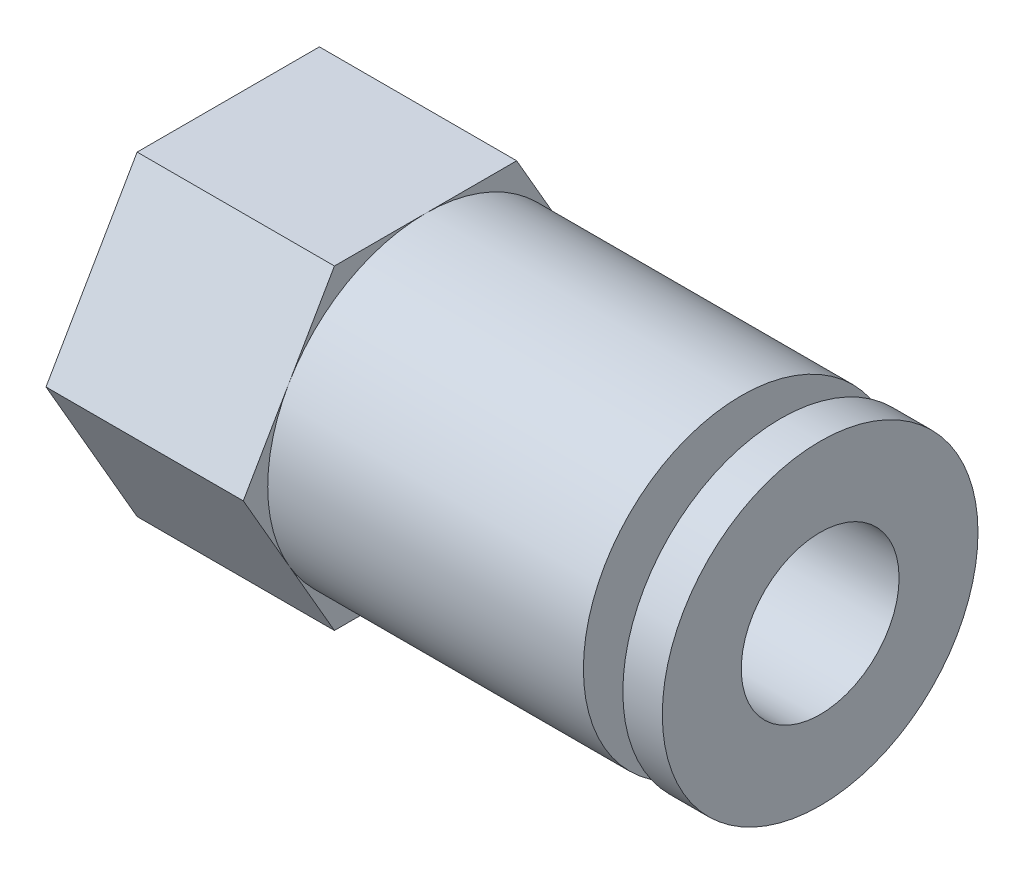
ISO-10303-21;
HEADER;
FILE_DESCRIPTION(('STEP AP214'),'2;1');
FILE_NAME('part.step','',(''),(''),'','','');
FILE_SCHEMA(('AUTOMOTIVE_DESIGN { 1 0 10303 214 1 1 1 1 }'));
ENDSEC;
DATA;
#1=APPLICATION_CONTEXT('core data for automotive mechanical design processes');
#2=APPLICATION_PROTOCOL_DEFINITION('international standard','automotive_design',2000,#1);
#3=PRODUCT_CONTEXT('',#1,'mechanical');
#4=PRODUCT('Part','Part','',(#3));
#5=PRODUCT_RELATED_PRODUCT_CATEGORY('part','',(#4));
#6=PRODUCT_DEFINITION_FORMATION('','',#4);
#7=PRODUCT_DEFINITION_CONTEXT('part definition',#1,'design');
#8=PRODUCT_DEFINITION('design','',#6,#7);
#9=PRODUCT_DEFINITION_SHAPE('','',#8);
#10=(LENGTH_UNIT() NAMED_UNIT(*) SI_UNIT(.MILLI.,.METRE.));
#11=(NAMED_UNIT(*) PLANE_ANGLE_UNIT() SI_UNIT($,.RADIAN.));
#12=(NAMED_UNIT(*) SI_UNIT($,.STERADIAN.) SOLID_ANGLE_UNIT());
#13=UNCERTAINTY_MEASURE_WITH_UNIT(LENGTH_MEASURE(1.E-05),#10,'distance_accuracy_value','');
#14=(GEOMETRIC_REPRESENTATION_CONTEXT(3) GLOBAL_UNCERTAINTY_ASSIGNED_CONTEXT((#13)) GLOBAL_UNIT_ASSIGNED_CONTEXT((#10,
#11,#12)) REPRESENTATION_CONTEXT('',''));
#15=CARTESIAN_POINT('',(0.,0.,0.));
#16=DIRECTION('',(0.,0.,1.));
#17=DIRECTION('',(1.,0.,0.));
#18=AXIS2_PLACEMENT_3D('',#15,#16,#17);
#19=CARTESIAN_POINT('',(5.,0.,0.));
#20=DIRECTION('',(1.,0.,0.));
#21=DIRECTION('',(0.,0.,-1.));
#22=AXIS2_PLACEMENT_3D('',#19,#20,#21);
#23=PLANE('',#22);
#24=CARTESIAN_POINT('',(5.,0.,0.));
#25=DIRECTION('',(1.,0.,0.));
#26=DIRECTION('',(0.,0.,-1.));
#27=AXIS2_PLACEMENT_3D('',#24,#25,#26);
#28=CIRCLE('',#27,4.);
#29=CARTESIAN_POINT('',(5.,2.,-3.46410161513775));
#30=VERTEX_POINT('',#29);
#31=CARTESIAN_POINT('',(5.,4.,0.));
#32=VERTEX_POINT('',#31);
#33=EDGE_CURVE('E127',#30,#32,#28,.T.);
#34=ORIENTED_EDGE('',*,*,#33,.F.);
#35=DIRECTION('',(0.,0.866025403784439,0.5));
#36=VECTOR('',#35,1.);
#37=CARTESIAN_POINT('',(5.,0.,-4.61880215351701));
#38=LINE('',#37,#36);
#39=CARTESIAN_POINT('',(5.,4.,-2.3094010767585));
#40=VERTEX_POINT('',#39);
#41=EDGE_CURVE('E116',#30,#40,#38,.T.);
#42=ORIENTED_EDGE('',*,*,#41,.T.);
#43=DIRECTION('',(0.,0.,1.));
#44=VECTOR('',#43,1.);
#45=CARTESIAN_POINT('',(5.,4.,-2.3094010767585));
#46=LINE('',#45,#44);
#47=EDGE_CURVE('E128',#40,#32,#46,.T.);
#48=ORIENTED_EDGE('',*,*,#47,.T.);
#49=EDGE_LOOP('',(#34,#42,#48));
#50=FACE_BOUND('',#49,.T.);
#51=ADVANCED_FACE('F36',(#50),#23,.T.);
#52=CARTESIAN_POINT('',(5.,2.,3.46410161513776));
#53=VERTEX_POINT('',#52);
#54=EDGE_CURVE('E45',#32,#53,#28,.T.);
#55=ORIENTED_EDGE('',*,*,#54,.F.);
#56=CARTESIAN_POINT('',(5.,4.,2.3094010767585));
#57=VERTEX_POINT('',#56);
#58=EDGE_CURVE('E143',#32,#57,#46,.T.);
#59=ORIENTED_EDGE('',*,*,#58,.T.);
#60=DIRECTION('',(0.,-0.866025403784439,0.5));
#61=VECTOR('',#60,1.);
#62=CARTESIAN_POINT('',(5.,4.,2.3094010767585));
#63=LINE('',#62,#61);
#64=EDGE_CURVE('E144',#57,#53,#63,.T.);
#65=ORIENTED_EDGE('',*,*,#64,.T.);
#66=EDGE_LOOP('',(#55,#59,#65));
#67=FACE_BOUND('',#66,.T.);
#68=ADVANCED_FACE('F207',(#67),#23,.T.);
#69=CARTESIAN_POINT('',(5.,-2.,3.46410161513775));
#70=VERTEX_POINT('',#69);
#71=EDGE_CURVE('E204',#53,#70,#28,.T.);
#72=ORIENTED_EDGE('',*,*,#71,.F.);
#73=CARTESIAN_POINT('',(5.,0.,4.618802153517));
#74=VERTEX_POINT('',#73);
#75=EDGE_CURVE('E142',#53,#74,#63,.T.);
#76=ORIENTED_EDGE('',*,*,#75,.T.);
#77=DIRECTION('',(0.,-0.866025403784438,-0.5));
#78=VECTOR('',#77,1.);
#79=CARTESIAN_POINT('',(5.,0.,4.618802153517));
#80=LINE('',#79,#78);
#81=EDGE_CURVE('E148',#74,#70,#80,.T.);
#82=ORIENTED_EDGE('',*,*,#81,.T.);
#83=EDGE_LOOP('',(#72,#76,#82));
#84=FACE_BOUND('',#83,.T.);
#85=ADVANCED_FACE('F213',(#84),#23,.T.);
#86=CARTESIAN_POINT('',(5.,-4.,0.));
#87=VERTEX_POINT('',#86);
#88=EDGE_CURVE('E136',#70,#87,#28,.T.);
#89=ORIENTED_EDGE('',*,*,#88,.F.);
#90=CARTESIAN_POINT('',(5.,-4.,2.3094010767585));
#91=VERTEX_POINT('',#90);
#92=EDGE_CURVE('E147',#70,#91,#80,.T.);
#93=ORIENTED_EDGE('',*,*,#92,.T.);
#94=DIRECTION('',(0.,0.,-1.));
#95=VECTOR('',#94,1.);
#96=CARTESIAN_POINT('',(5.,-4.,2.3094010767585));
#97=LINE('',#96,#95);
#98=EDGE_CURVE('E152',#91,#87,#97,.T.);
#99=ORIENTED_EDGE('',*,*,#98,.T.);
#100=EDGE_LOOP('',(#89,#93,#99));
#101=FACE_BOUND('',#100,.T.);
#102=ADVANCED_FACE('F202',(#101),#23,.T.);
#103=CARTESIAN_POINT('',(5.,-2.,-3.46410161513776));
#104=VERTEX_POINT('',#103);
#105=EDGE_CURVE('E61',#87,#104,#28,.T.);
#106=ORIENTED_EDGE('',*,*,#105,.F.);
#107=CARTESIAN_POINT('',(5.,-4.,-2.3094010767585));
#108=VERTEX_POINT('',#107);
#109=EDGE_CURVE('E151',#87,#108,#97,.T.);
#110=ORIENTED_EDGE('',*,*,#109,.T.);
#111=DIRECTION('',(0.,0.866025403784439,-0.5));
#112=VECTOR('',#111,1.);
#113=CARTESIAN_POINT('',(5.,-4.,-2.3094010767585));
#114=LINE('',#113,#112);
#115=EDGE_CURVE('E125',#108,#104,#114,.T.);
#116=ORIENTED_EDGE('',*,*,#115,.T.);
#117=EDGE_LOOP('',(#106,#110,#116));
#118=FACE_BOUND('',#117,.T.);
#119=ADVANCED_FACE('F200',(#118),#23,.T.);
#120=CARTESIAN_POINT('',(5.,4.,-2.3094010767585));
#121=DIRECTION('',(0.,-1.,0.));
#122=DIRECTION('',(0.,0.,-1.));
#123=AXIS2_PLACEMENT_3D('',#120,#121,#122);
#124=PLANE('',#123);
#125=DIRECTION('',(0.,0.,1.));
#126=VECTOR('',#125,1.);
#127=CARTESIAN_POINT('',(0.,4.,-2.3094010767585));
#128=LINE('',#127,#126);
#129=CARTESIAN_POINT('',(0.,4.,-2.3094010767585));
#130=VERTEX_POINT('',#129);
#131=CARTESIAN_POINT('',(0.,4.,2.3094010767585));
#132=VERTEX_POINT('',#131);
#133=EDGE_CURVE('E156',#130,#132,#128,.T.);
#134=ORIENTED_EDGE('',*,*,#133,.T.);
#135=DIRECTION('',(-1.,0.,0.));
#136=VECTOR('',#135,1.);
#137=CARTESIAN_POINT('',(5.,4.,2.3094010767585));
#138=LINE('',#137,#136);
#139=EDGE_CURVE('E40',#57,#132,#138,.T.);
#140=ORIENTED_EDGE('',*,*,#139,.F.);
#141=ORIENTED_EDGE('',*,*,#58,.F.);
#142=ORIENTED_EDGE('',*,*,#47,.F.);
#143=DIRECTION('',(-1.,0.,0.));
#144=VECTOR('',#143,1.);
#145=CARTESIAN_POINT('',(5.,4.,-2.3094010767585));
#146=LINE('',#145,#144);
#147=EDGE_CURVE('E115',#40,#130,#146,.T.);
#148=ORIENTED_EDGE('',*,*,#147,.T.);
#149=EDGE_LOOP('',(#134,#140,#141,#142,#148));
#150=FACE_BOUND('',#149,.T.);
#151=ADVANCED_FACE('F38',(#150),#124,.F.);
#152=CARTESIAN_POINT('',(5.,4.,2.3094010767585));
#153=DIRECTION('',(0.,-0.5,-0.866025403784439));
#154=DIRECTION('',(0.,0.866025403784439,-0.5));
#155=AXIS2_PLACEMENT_3D('',#152,#153,#154);
#156=PLANE('',#155);
#157=DIRECTION('',(0.,-0.866025403784439,0.5));
#158=VECTOR('',#157,1.);
#159=CARTESIAN_POINT('',(0.,4.,2.3094010767585));
#160=LINE('',#159,#158);
#161=CARTESIAN_POINT('',(0.,0.,4.618802153517));
#162=VERTEX_POINT('',#161);
#163=EDGE_CURVE('E159',#132,#162,#160,.T.);
#164=ORIENTED_EDGE('',*,*,#163,.T.);
#165=DIRECTION('',(-1.,0.,0.));
#166=VECTOR('',#165,1.);
#167=CARTESIAN_POINT('',(5.,0.,4.618802153517));
#168=LINE('',#167,#166);
#169=EDGE_CURVE('E138',#74,#162,#168,.T.);
#170=ORIENTED_EDGE('',*,*,#169,.F.);
#171=ORIENTED_EDGE('',*,*,#75,.F.);
#172=ORIENTED_EDGE('',*,*,#64,.F.);
#173=ORIENTED_EDGE('',*,*,#139,.T.);
#174=EDGE_LOOP('',(#164,#170,#171,#172,#173));
#175=FACE_BOUND('',#174,.T.);
#176=ADVANCED_FACE('F211',(#175),#156,.F.);
#177=CARTESIAN_POINT('',(5.,0.,4.618802153517));
#178=DIRECTION('',(0.,0.5,-0.866025403784438));
#179=DIRECTION('',(0.,0.866025403784438,0.5));
#180=AXIS2_PLACEMENT_3D('',#177,#178,#179);
#181=PLANE('',#180);
#182=DIRECTION('',(0.,-0.866025403784438,-0.5));
#183=VECTOR('',#182,1.);
#184=CARTESIAN_POINT('',(0.,0.,4.618802153517));
#185=LINE('',#184,#183);
#186=CARTESIAN_POINT('',(0.,-4.,2.3094010767585));
#187=VERTEX_POINT('',#186);
#188=EDGE_CURVE('E161',#162,#187,#185,.T.);
#189=ORIENTED_EDGE('',*,*,#188,.T.);
#190=DIRECTION('',(-1.,0.,0.));
#191=VECTOR('',#190,1.);
#192=CARTESIAN_POINT('',(5.,-4.,2.3094010767585));
#193=LINE('',#192,#191);
#194=EDGE_CURVE('E175',#91,#187,#193,.T.);
#195=ORIENTED_EDGE('',*,*,#194,.F.);
#196=ORIENTED_EDGE('',*,*,#92,.F.);
#197=ORIENTED_EDGE('',*,*,#81,.F.);
#198=ORIENTED_EDGE('',*,*,#169,.T.);
#199=EDGE_LOOP('',(#189,#195,#196,#197,#198));
#200=FACE_BOUND('',#199,.T.);
#201=ADVANCED_FACE('F182',(#200),#181,.F.);
#202=CARTESIAN_POINT('',(5.,-4.,2.3094010767585));
#203=DIRECTION('',(0.,1.,0.));
#204=DIRECTION('',(0.,0.,1.));
#205=AXIS2_PLACEMENT_3D('',#202,#203,#204);
#206=PLANE('',#205);
#207=DIRECTION('',(0.,0.,-1.));
#208=VECTOR('',#207,1.);
#209=CARTESIAN_POINT('',(0.,-4.,2.3094010767585));
#210=LINE('',#209,#208);
#211=CARTESIAN_POINT('',(0.,-4.,-2.3094010767585));
#212=VERTEX_POINT('',#211);
#213=EDGE_CURVE('E163',#187,#212,#210,.T.);
#214=ORIENTED_EDGE('',*,*,#213,.T.);
#215=DIRECTION('',(-1.,0.,0.));
#216=VECTOR('',#215,1.);
#217=CARTESIAN_POINT('',(5.,-4.,-2.3094010767585));
#218=LINE('',#217,#216);
#219=EDGE_CURVE('E172',#108,#212,#218,.T.);
#220=ORIENTED_EDGE('',*,*,#219,.F.);
#221=ORIENTED_EDGE('',*,*,#109,.F.);
#222=ORIENTED_EDGE('',*,*,#98,.F.);
#223=ORIENTED_EDGE('',*,*,#194,.T.);
#224=EDGE_LOOP('',(#214,#220,#221,#222,#223));
#225=FACE_BOUND('',#224,.T.);
#226=ADVANCED_FACE('F195',(#225),#206,.F.);
#227=CARTESIAN_POINT('',(5.,-4.,-2.3094010767585));
#228=DIRECTION('',(0.,0.5,0.866025403784439));
#229=DIRECTION('',(0.,-0.866025403784439,0.5));
#230=AXIS2_PLACEMENT_3D('',#227,#228,#229);
#231=PLANE('',#230);
#232=DIRECTION('',(0.,0.866025403784439,-0.5));
#233=VECTOR('',#232,1.);
#234=CARTESIAN_POINT('',(0.,-4.,-2.3094010767585));
#235=LINE('',#234,#233);
#236=CARTESIAN_POINT('',(0.,0.,-4.61880215351701));
#237=VERTEX_POINT('',#236);
#238=EDGE_CURVE('E165',#212,#237,#235,.T.);
#239=ORIENTED_EDGE('',*,*,#238,.T.);
#240=DIRECTION('',(-1.,0.,0.));
#241=VECTOR('',#240,1.);
#242=CARTESIAN_POINT('',(5.,0.,-4.61880215351701));
#243=LINE('',#242,#241);
#244=CARTESIAN_POINT('',(5.,0.,-4.61880215351701));
#245=VERTEX_POINT('',#244);
#246=EDGE_CURVE('E170',#245,#237,#243,.T.);
#247=ORIENTED_EDGE('',*,*,#246,.F.);
#248=EDGE_CURVE('E111',#104,#245,#114,.T.);
#249=ORIENTED_EDGE('',*,*,#248,.F.);
#250=ORIENTED_EDGE('',*,*,#115,.F.);
#251=ORIENTED_EDGE('',*,*,#219,.T.);
#252=EDGE_LOOP('',(#239,#247,#249,#250,#251));
#253=FACE_BOUND('',#252,.T.);
#254=ADVANCED_FACE('F199',(#253),#231,.F.);
#255=CARTESIAN_POINT('',(5.,0.,-4.61880215351701));
#256=DIRECTION('',(0.,-0.5,0.866025403784438));
#257=DIRECTION('',(0.,-0.866025403784438,-0.5));
#258=AXIS2_PLACEMENT_3D('',#255,#256,#257);
#259=PLANE('',#258);
#260=DIRECTION('',(0.,0.866025403784439,0.5));
#261=VECTOR('',#260,1.);
#262=CARTESIAN_POINT('',(0.,0.,-4.61880215351701));
#263=LINE('',#262,#261);
#264=EDGE_CURVE('E167',#237,#130,#263,.T.);
#265=ORIENTED_EDGE('',*,*,#264,.T.);
#266=ORIENTED_EDGE('',*,*,#147,.F.);
#267=ORIENTED_EDGE('',*,*,#41,.F.);
#268=EDGE_CURVE('E108',#245,#30,#38,.T.);
#269=ORIENTED_EDGE('',*,*,#268,.F.);
#270=ORIENTED_EDGE('',*,*,#246,.T.);
#271=EDGE_LOOP('',(#265,#266,#267,#269,#270));
#272=FACE_BOUND('',#271,.T.);
#273=ADVANCED_FACE('F120',(#272),#259,.F.);
#274=EDGE_CURVE('E53',#104,#30,#28,.T.);
#275=ORIENTED_EDGE('',*,*,#274,.F.);
#276=ORIENTED_EDGE('',*,*,#248,.T.);
#277=ORIENTED_EDGE('',*,*,#268,.T.);
#278=EDGE_LOOP('',(#275,#276,#277));
#279=FACE_BOUND('',#278,.T.);
#280=ADVANCED_FACE('F110',(#279),#23,.T.);
#281=CARTESIAN_POINT('',(0.,0.,0.));
#282=DIRECTION('',(1.,0.,0.));
#283=DIRECTION('',(0.,0.,-1.));
#284=AXIS2_PLACEMENT_3D('',#281,#282,#283);
#285=PLANE('',#284);
#286=CARTESIAN_POINT('',(0.,0.,0.));
#287=DIRECTION('',(1.,0.,0.));
#288=DIRECTION('',(0.,0.,-1.));
#289=AXIS2_PLACEMENT_3D('',#286,#287,#288);
#290=CIRCLE('',#289,2.);
#291=CARTESIAN_POINT('',(0.,0.,-2.));
#292=VERTEX_POINT('',#291);
#293=EDGE_CURVE('E414',#292,#292,#290,.T.);
#294=ORIENTED_EDGE('',*,*,#293,.T.);
#295=EDGE_LOOP('',(#294));
#296=FACE_BOUND('',#295,.T.);
#297=ORIENTED_EDGE('',*,*,#133,.F.);
#298=ORIENTED_EDGE('',*,*,#264,.F.);
#299=ORIENTED_EDGE('',*,*,#238,.F.);
#300=ORIENTED_EDGE('',*,*,#213,.F.);
#301=ORIENTED_EDGE('',*,*,#188,.F.);
#302=ORIENTED_EDGE('',*,*,#163,.F.);
#303=EDGE_LOOP('',(#297,#298,#299,#300,#301,#302));
#304=FACE_BOUND('',#303,.T.);
#305=ADVANCED_FACE('F190',(#296,#304),#285,.F.);
#306=CARTESIAN_POINT('',(13.,0.,0.));
#307=DIRECTION('',(-1.,0.,0.));
#308=DIRECTION('',(0.,0.,1.));
#309=AXIS2_PLACEMENT_3D('',#306,#307,#308);
#310=CYLINDRICAL_SURFACE('',#309,4.);
#311=CARTESIAN_POINT('',(13.,0.,0.));
#312=DIRECTION('',(1.,0.,0.));
#313=DIRECTION('',(0.,0.,-1.));
#314=AXIS2_PLACEMENT_3D('',#311,#312,#313);
#315=CIRCLE('',#314,4.);
#316=CARTESIAN_POINT('',(13.,0.,-4.));
#317=VERTEX_POINT('',#316);
#318=EDGE_CURVE('E131',#317,#317,#315,.T.);
#319=ORIENTED_EDGE('',*,*,#318,.F.);
#320=EDGE_LOOP('',(#319));
#321=FACE_BOUND('',#320,.T.);
#322=ORIENTED_EDGE('',*,*,#33,.T.);
#323=ORIENTED_EDGE('',*,*,#54,.T.);
#324=ORIENTED_EDGE('',*,*,#71,.T.);
#325=ORIENTED_EDGE('',*,*,#88,.T.);
#326=ORIENTED_EDGE('',*,*,#105,.T.);
#327=ORIENTED_EDGE('',*,*,#274,.T.);
#328=EDGE_LOOP('',(#322,#323,#324,#325,#326,#327));
#329=FACE_BOUND('',#328,.T.);
#330=ADVANCED_FACE('F134',(#321,#329),#310,.T.);
#331=CARTESIAN_POINT('',(13.,0.,0.));
#332=DIRECTION('',(1.,0.,0.));
#333=DIRECTION('',(0.,0.,-1.));
#334=AXIS2_PLACEMENT_3D('',#331,#332,#333);
#335=PLANE('',#334);
#336=CARTESIAN_POINT('',(13.,0.,0.));
#337=DIRECTION('',(1.,0.,0.));
#338=DIRECTION('',(0.,0.,-1.));
#339=AXIS2_PLACEMENT_3D('',#336,#337,#338);
#340=CIRCLE('',#339,2.5);
#341=CARTESIAN_POINT('',(13.,0.,-2.5));
#342=VERTEX_POINT('',#341);
#343=EDGE_CURVE('E11',#342,#342,#340,.T.);
#344=ORIENTED_EDGE('',*,*,#343,.F.);
#345=EDGE_LOOP('',(#344));
#346=FACE_BOUND('',#345,.T.);
#347=ORIENTED_EDGE('',*,*,#318,.T.);
#348=EDGE_LOOP('',(#347));
#349=FACE_BOUND('',#348,.T.);
#350=ADVANCED_FACE('F309',(#346,#349),#335,.T.);
#351=CARTESIAN_POINT('',(14.,0.,0.));
#352=DIRECTION('',(-1.,0.,0.));
#353=DIRECTION('',(0.,0.,1.));
#354=AXIS2_PLACEMENT_3D('',#351,#352,#353);
#355=CYLINDRICAL_SURFACE('',#354,2.5);
#356=CARTESIAN_POINT('',(14.,0.,0.));
#357=DIRECTION('',(1.,0.,0.));
#358=DIRECTION('',(0.,0.,-1.));
#359=AXIS2_PLACEMENT_3D('',#356,#357,#358);
#360=CIRCLE('',#359,2.5);
#361=CARTESIAN_POINT('',(14.,0.,-2.5));
#362=VERTEX_POINT('',#361);
#363=EDGE_CURVE('E132',#362,#362,#360,.T.);
#364=ORIENTED_EDGE('',*,*,#363,.F.);
#365=EDGE_LOOP('',(#364));
#366=FACE_BOUND('',#365,.T.);
#367=ORIENTED_EDGE('',*,*,#343,.T.);
#368=EDGE_LOOP('',(#367));
#369=FACE_BOUND('',#368,.T.);
#370=ADVANCED_FACE('F315',(#366,#369),#355,.T.);
#371=CARTESIAN_POINT('',(15.,0.,0.));
#372=DIRECTION('',(-1.,0.,0.));
#373=DIRECTION('',(0.,0.,1.));
#374=AXIS2_PLACEMENT_3D('',#371,#372,#373);
#375=CYLINDRICAL_SURFACE('',#374,4.);
#376=CARTESIAN_POINT('',(15.,0.,0.));
#377=DIRECTION('',(1.,0.,0.));
#378=DIRECTION('',(0.,0.,-1.));
#379=AXIS2_PLACEMENT_3D('',#376,#377,#378);
#380=CIRCLE('',#379,4.);
#381=CARTESIAN_POINT('',(15.,0.,-4.));
#382=VERTEX_POINT('',#381);
#383=EDGE_CURVE('E422',#382,#382,#380,.T.);
#384=ORIENTED_EDGE('',*,*,#383,.F.);
#385=EDGE_LOOP('',(#384));
#386=FACE_BOUND('',#385,.T.);
#387=CARTESIAN_POINT('',(14.,0.,0.));
#388=DIRECTION('',(1.,0.,0.));
#389=DIRECTION('',(0.,0.,-1.));
#390=AXIS2_PLACEMENT_3D('',#387,#388,#389);
#391=CIRCLE('',#390,4.);
#392=CARTESIAN_POINT('',(14.,0.,-4.));
#393=VERTEX_POINT('',#392);
#394=EDGE_CURVE('E419',#393,#393,#391,.T.);
#395=ORIENTED_EDGE('',*,*,#394,.T.);
#396=EDGE_LOOP('',(#395));
#397=FACE_BOUND('',#396,.T.);
#398=ADVANCED_FACE('F324',(#386,#397),#375,.T.);
#399=CARTESIAN_POINT('',(15.,0.,0.));
#400=DIRECTION('',(1.,0.,0.));
#401=DIRECTION('',(0.,0.,-1.));
#402=AXIS2_PLACEMENT_3D('',#399,#400,#401);
#403=PLANE('',#402);
#404=CARTESIAN_POINT('',(15.,0.,0.));
#405=DIRECTION('',(1.,0.,0.));
#406=DIRECTION('',(0.,0.,-1.));
#407=AXIS2_PLACEMENT_3D('',#404,#405,#406);
#408=CIRCLE('',#407,2.);
#409=CARTESIAN_POINT('',(15.,0.,-2.));
#410=VERTEX_POINT('',#409);
#411=EDGE_CURVE('E417',#410,#410,#408,.T.);
#412=ORIENTED_EDGE('',*,*,#411,.F.);
#413=EDGE_LOOP('',(#412));
#414=FACE_BOUND('',#413,.T.);
#415=ORIENTED_EDGE('',*,*,#383,.T.);
#416=EDGE_LOOP('',(#415));
#417=FACE_BOUND('',#416,.T.);
#418=ADVANCED_FACE('F332',(#414,#417),#403,.T.);
#419=CARTESIAN_POINT('',(14.,0.,0.));
#420=DIRECTION('',(1.,0.,0.));
#421=DIRECTION('',(0.,0.,-1.));
#422=AXIS2_PLACEMENT_3D('',#419,#420,#421);
#423=PLANE('',#422);
#424=ORIENTED_EDGE('',*,*,#363,.T.);
#425=EDGE_LOOP('',(#424));
#426=FACE_BOUND('',#425,.T.);
#427=ORIENTED_EDGE('',*,*,#394,.F.);
#428=EDGE_LOOP('',(#427));
#429=FACE_BOUND('',#428,.T.);
#430=ADVANCED_FACE('F339',(#426,#429),#423,.F.);
#431=CARTESIAN_POINT('',(0.,0.,0.));
#432=DIRECTION('',(1.,0.,0.));
#433=DIRECTION('',(0.,0.,-1.));
#434=AXIS2_PLACEMENT_3D('',#431,#432,#433);
#435=CYLINDRICAL_SURFACE('',#434,2.);
#436=ORIENTED_EDGE('',*,*,#293,.F.);
#437=EDGE_LOOP('',(#436));
#438=FACE_BOUND('',#437,.T.);
#439=ORIENTED_EDGE('',*,*,#411,.T.);
#440=EDGE_LOOP('',(#439));
#441=FACE_BOUND('',#440,.T.);
#442=ADVANCED_FACE('F347',(#438,#441),#435,.F.);
#443=CLOSED_SHELL('',(#51,#68,#85,#102,#119,#151,#176,#201,#226,#254,#273,#280,#305,#330,#350,
#370,#398,#418,#430,#442));
#444=MANIFOLD_SOLID_BREP('B2',#443);
#445=ADVANCED_BREP_SHAPE_REPRESENTATION('',(#18,#444),#14);
#446=SHAPE_DEFINITION_REPRESENTATION(#9,#445);
ENDSEC;
END-ISO-10303-21;
